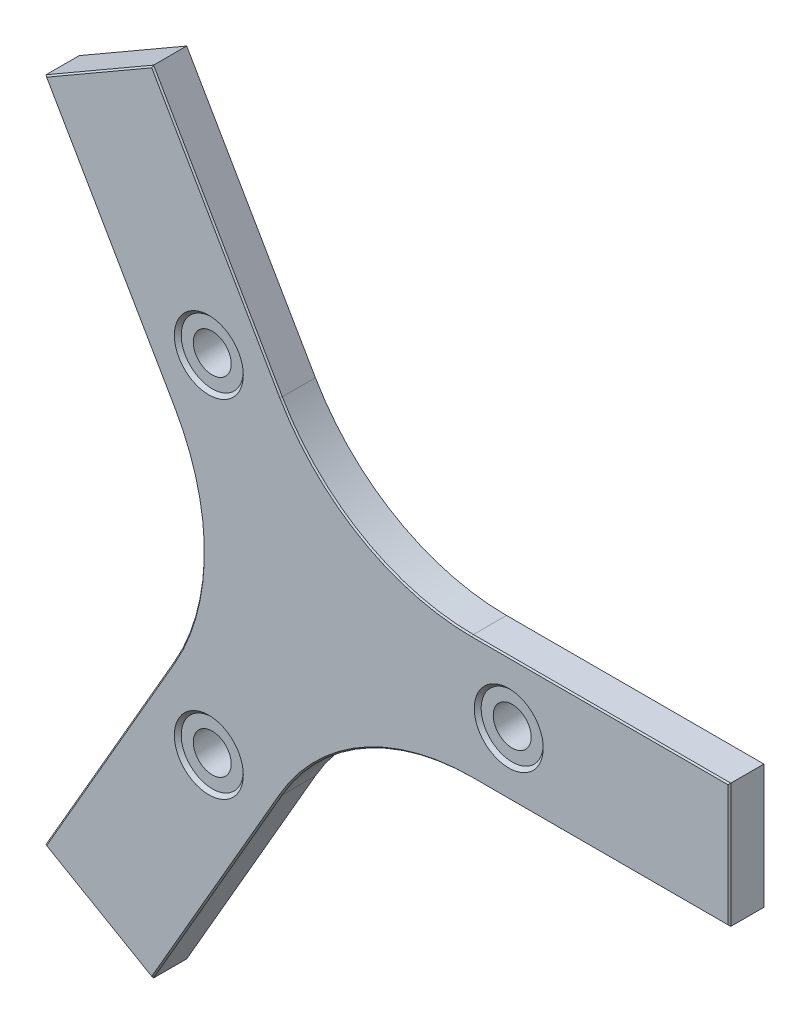
ISO-10303-21;
HEADER;
FILE_DESCRIPTION(('STEP AP214'),'2;1');
FILE_NAME('part.step','',(''),(''),'','','');
FILE_SCHEMA(('AUTOMOTIVE_DESIGN { 1 0 10303 214 1 1 1 1 }'));
ENDSEC;
DATA;
#1=APPLICATION_CONTEXT('core data for automotive mechanical design processes');
#2=APPLICATION_PROTOCOL_DEFINITION('international standard','automotive_design',2000,#1);
#3=PRODUCT_CONTEXT('',#1,'mechanical');
#4=PRODUCT('Part','Part','',(#3));
#5=PRODUCT_RELATED_PRODUCT_CATEGORY('part','',(#4));
#6=PRODUCT_DEFINITION_FORMATION('','',#4);
#7=PRODUCT_DEFINITION_CONTEXT('part definition',#1,'design');
#8=PRODUCT_DEFINITION('design','',#6,#7);
#9=PRODUCT_DEFINITION_SHAPE('','',#8);
#10=(LENGTH_UNIT() NAMED_UNIT(*) SI_UNIT(.MILLI.,.METRE.));
#11=(NAMED_UNIT(*) PLANE_ANGLE_UNIT() SI_UNIT($,.RADIAN.));
#12=(NAMED_UNIT(*) SI_UNIT($,.STERADIAN.) SOLID_ANGLE_UNIT());
#13=UNCERTAINTY_MEASURE_WITH_UNIT(LENGTH_MEASURE(1.E-05),#10,'distance_accuracy_value','');
#14=(GEOMETRIC_REPRESENTATION_CONTEXT(3) GLOBAL_UNCERTAINTY_ASSIGNED_CONTEXT((#13)) GLOBAL_UNIT_ASSIGNED_CONTEXT((#10,
#11,#12)) REPRESENTATION_CONTEXT('',''));
#15=CARTESIAN_POINT('',(0.,0.,0.));
#16=DIRECTION('',(0.,0.,1.));
#17=DIRECTION('',(1.,0.,0.));
#18=AXIS2_PLACEMENT_3D('',#15,#16,#17);
#19=CARTESIAN_POINT('',(29.,0.,78.9999999999509));
#20=DIRECTION('',(0.,0.,1.));
#21=DIRECTION('',(1.,0.,0.));
#22=AXIS2_PLACEMENT_3D('',#19,#20,#21);
#23=CONICAL_SURFACE('',#22,4.99999999993865,0.785398163397448);
#24=CARTESIAN_POINT('',(29.,0.,79.0000000000077));
#25=DIRECTION('',(0.,0.,1.));
#26=DIRECTION('',(1.,0.,0.));
#27=AXIS2_PLACEMENT_3D('',#24,#25,#26);
#28=CIRCLE('',#27,4.9999999999955);
#29=CARTESIAN_POINT('',(33.9999999999955,0.,79.0000000000077));
#30=VERTEX_POINT('',#29);
#31=EDGE_CURVE('E267',#30,#30,#28,.T.);
#32=ORIENTED_EDGE('',*,*,#31,.T.);
#33=EDGE_LOOP('',(#32));
#34=FACE_BOUND('',#33,.T.);
#35=CARTESIAN_POINT('',(29.,0.,78.5000000000196));
#36=DIRECTION('',(0.,0.,1.));
#37=DIRECTION('',(1.,0.,0.));
#38=AXIS2_PLACEMENT_3D('',#35,#36,#37);
#39=CIRCLE('',#38,4.50000000000732);
#40=CARTESIAN_POINT('',(33.5000000000073,0.,78.5000000000196));
#41=VERTEX_POINT('',#40);
#42=EDGE_CURVE('E264',#41,#41,#39,.T.);
#43=ORIENTED_EDGE('',*,*,#42,.F.);
#44=EDGE_LOOP('',(#43));
#45=FACE_BOUND('',#44,.T.);
#46=ADVANCED_FACE('F17',(#34,#45),#23,.F.);
#47=CARTESIAN_POINT('',(-14.5,-25.1147367097486,78.9999999999509));
#48=DIRECTION('',(0.,0.,1.));
#49=DIRECTION('',(1.,0.,0.));
#50=AXIS2_PLACEMENT_3D('',#47,#48,#49);
#51=CONICAL_SURFACE('',#50,4.99999999991465,0.785398163397448);
#52=CARTESIAN_POINT('',(-14.5,-25.1147367097486,79.0000000000077));
#53=DIRECTION('',(0.,0.,1.));
#54=DIRECTION('',(1.,0.,0.));
#55=AXIS2_PLACEMENT_3D('',#52,#53,#54);
#56=CIRCLE('',#55,4.99999999997149);
#57=CARTESIAN_POINT('',(-9.50000000002851,-25.1147367097486,79.0000000000077));
#58=VERTEX_POINT('',#57);
#59=EDGE_CURVE('E269',#58,#58,#56,.T.);
#60=ORIENTED_EDGE('',*,*,#59,.T.);
#61=EDGE_LOOP('',(#60));
#62=FACE_BOUND('',#61,.T.);
#63=CARTESIAN_POINT('',(-14.5,-25.1147367097486,78.5000000000196));
#64=DIRECTION('',(0.,0.,1.));
#65=DIRECTION('',(1.,0.,0.));
#66=AXIS2_PLACEMENT_3D('',#63,#64,#65);
#67=CIRCLE('',#66,4.49999999998331);
#68=CARTESIAN_POINT('',(-10.0000000000167,-25.1147367097486,78.5000000000196));
#69=VERTEX_POINT('',#68);
#70=EDGE_CURVE('E261',#69,#69,#67,.T.);
#71=ORIENTED_EDGE('',*,*,#70,.F.);
#72=EDGE_LOOP('',(#71));
#73=FACE_BOUND('',#72,.T.);
#74=ADVANCED_FACE('F291',(#62,#73),#51,.F.);
#75=CARTESIAN_POINT('',(-14.4999999999993,25.1147367097493,78.9999999999509));
#76=DIRECTION('',(0.,0.,1.));
#77=DIRECTION('',(1.,0.,0.));
#78=AXIS2_PLACEMENT_3D('',#75,#76,#77);
#79=CONICAL_SURFACE('',#78,4.99999999990643,0.785398163397448);
#80=CARTESIAN_POINT('',(-14.4999999999993,25.1147367097493,79.0000000000077));
#81=DIRECTION('',(0.,0.,1.));
#82=DIRECTION('',(1.,0.,0.));
#83=AXIS2_PLACEMENT_3D('',#80,#81,#82);
#84=CIRCLE('',#83,4.99999999996327);
#85=CARTESIAN_POINT('',(-9.50000000003603,25.1147367097493,79.0000000000077));
#86=VERTEX_POINT('',#85);
#87=EDGE_CURVE('E20',#86,#86,#84,.T.);
#88=ORIENTED_EDGE('',*,*,#87,.T.);
#89=EDGE_LOOP('',(#88));
#90=FACE_BOUND('',#89,.T.);
#91=CARTESIAN_POINT('',(-14.4999999999993,25.1147367097493,78.5000000000196));
#92=DIRECTION('',(0.,0.,1.));
#93=DIRECTION('',(1.,0.,0.));
#94=AXIS2_PLACEMENT_3D('',#91,#92,#93);
#95=CIRCLE('',#94,4.4999999999751);
#96=CARTESIAN_POINT('',(-10.0000000000242,25.1147367097493,78.5000000000196));
#97=VERTEX_POINT('',#96);
#98=EDGE_CURVE('E159',#97,#97,#95,.T.);
#99=ORIENTED_EDGE('',*,*,#98,.F.);
#100=EDGE_LOOP('',(#99));
#101=FACE_BOUND('',#100,.T.);
#102=ADVANCED_FACE('F276',(#90,#101),#79,.F.);
#103=CARTESIAN_POINT('',(3.41948691584548E-13,6.12843109593086E-13,79.));
#104=DIRECTION('',(0.,0.,-1.));
#105=DIRECTION('',(-1.,0.,0.));
#106=AXIS2_PLACEMENT_3D('',#103,#104,#105);
#107=PLANE('',#106);
#108=DIRECTION('',(0.866025403784439,0.5,0.));
#109=VECTOR('',#108,1.);
#110=CARTESIAN_POINT('',(-38.0210235533021,48.2543445500939,79.));
#111=LINE('',#110,#109);
#112=CARTESIAN_POINT('',(-38.0210235533022,48.2543445500939,79.));
#113=VERTEX_POINT('',#112);
#114=CARTESIAN_POINT('',(-22.7789764466961,57.0543445500938,79.));
#115=VERTEX_POINT('',#114);
#116=EDGE_CURVE('E211',#113,#115,#111,.T.);
#117=ORIENTED_EDGE('',*,*,#116,.F.);
#118=DIRECTION('',(-0.5,0.86602540378444,0.));
#119=VECTOR('',#118,1.);
#120=CARTESIAN_POINT('',(-19.4567040716902,16.100000000001,79.));
#121=LINE('',#120,#119);
#122=CARTESIAN_POINT('',(-19.4567040716902,16.1000000000007,79.));
#123=VERTEX_POINT('',#122);
#124=EDGE_CURVE('E149',#123,#113,#121,.T.);
#125=ORIENTED_EDGE('',*,*,#124,.F.);
#126=CARTESIAN_POINT('',(-47.3427220735486,7.28306304154103E-13,79.));
#127=DIRECTION('',(0.,0.,1.));
#128=DIRECTION('',(1.,0.,0.));
#129=AXIS2_PLACEMENT_3D('',#126,#127,#128);
#130=CIRCLE('',#129,32.2);
#131=CARTESIAN_POINT('',(-19.45670407169,-16.0999999999993,79.));
#132=VERTEX_POINT('',#131);
#133=EDGE_CURVE('E140',#123,#132,#130,.F.);
#134=ORIENTED_EDGE('',*,*,#133,.T.);
#135=DIRECTION('',(0.5,0.866025403784439,0.));
#136=VECTOR('',#135,1.);
#137=CARTESIAN_POINT('',(-38.0210235533022,-48.2543445500923,79.));
#138=LINE('',#137,#136);
#139=CARTESIAN_POINT('',(-38.0210235533022,-48.2543445500923,79.));
#140=VERTEX_POINT('',#139);
#141=EDGE_CURVE('E146',#140,#132,#138,.T.);
#142=ORIENTED_EDGE('',*,*,#141,.F.);
#143=DIRECTION('',(-0.866025403784438,0.5,0.));
#144=VECTOR('',#143,1.);
#145=CARTESIAN_POINT('',(-22.7789764466961,-57.0543445500924,79.));
#146=LINE('',#145,#144);
#147=CARTESIAN_POINT('',(-22.7789764466961,-57.0543445500924,79.));
#148=VERTEX_POINT('',#147);
#149=EDGE_CURVE('E177',#148,#140,#146,.T.);
#150=ORIENTED_EDGE('',*,*,#149,.F.);
#151=DIRECTION('',(-0.5,-0.866025403784439,0.));
#152=VECTOR('',#151,1.);
#153=CARTESIAN_POINT('',(-4.21465696508395,-24.8999999999994,79.));
#154=LINE('',#153,#152);
#155=CARTESIAN_POINT('',(-4.21465696508414,-24.8999999999996,79.));
#156=VERTEX_POINT('',#155);
#157=EDGE_CURVE('E174',#156,#148,#154,.T.);
#158=ORIENTED_EDGE('',*,*,#157,.F.);
#159=CARTESIAN_POINT('',(23.671361036775,-41.,79.));
#160=DIRECTION('',(0.,0.,1.));
#161=DIRECTION('',(1.,0.,0.));
#162=AXIS2_PLACEMENT_3D('',#159,#160,#161);
#163=CIRCLE('',#162,32.2);
#164=CARTESIAN_POINT('',(23.671361036775,-8.79999999999962,79.));
#165=VERTEX_POINT('',#164);
#166=EDGE_CURVE('E253',#156,#165,#163,.F.);
#167=ORIENTED_EDGE('',*,*,#166,.T.);
#168=DIRECTION('',(1.,0.,0.));
#169=VECTOR('',#168,1.);
#170=CARTESIAN_POINT('',(11.8356805183877,-8.79999999999941,79.));
#171=LINE('',#170,#169);
#172=CARTESIAN_POINT('',(60.8,-8.79999999999934,79.));
#173=VERTEX_POINT('',#172);
#174=EDGE_CURVE('E186',#173,#165,#171,.F.);
#175=ORIENTED_EDGE('',*,*,#174,.F.);
#176=DIRECTION('',(0.,1.,0.));
#177=VECTOR('',#176,1.);
#178=CARTESIAN_POINT('',(60.8,-4.49999999999939,79.));
#179=LINE('',#178,#177);
#180=CARTESIAN_POINT('',(60.8,8.80000000000057,79.));
#181=VERTEX_POINT('',#180);
#182=EDGE_CURVE('E193',#181,#173,#179,.F.);
#183=ORIENTED_EDGE('',*,*,#182,.F.);
#184=DIRECTION('',(1.,0.,0.));
#185=VECTOR('',#184,1.);
#186=CARTESIAN_POINT('',(30.5,8.80000000000058,79.));
#187=LINE('',#186,#185);
#188=CARTESIAN_POINT('',(23.671361036775,8.80000000000059,79.));
#189=VERTEX_POINT('',#188);
#190=EDGE_CURVE('E199',#189,#181,#187,.T.);
#191=ORIENTED_EDGE('',*,*,#190,.F.);
#192=CARTESIAN_POINT('',(23.671361036775,41.0000000000006,79.));
#193=DIRECTION('',(0.,0.,1.));
#194=DIRECTION('',(1.,0.,0.));
#195=AXIS2_PLACEMENT_3D('',#192,#193,#194);
#196=CIRCLE('',#195,32.2);
#197=CARTESIAN_POINT('',(-4.21465696508386,24.9000000000005,79.));
#198=VERTEX_POINT('',#197);
#199=EDGE_CURVE('E202',#189,#198,#196,.F.);
#200=ORIENTED_EDGE('',*,*,#199,.T.);
#201=DIRECTION('',(0.5,-0.86602540378444,0.));
#202=VECTOR('',#201,1.);
#203=CARTESIAN_POINT('',(-22.7789764466961,57.0543445500938,79.));
#204=LINE('',#203,#202);
#205=EDGE_CURVE('E205',#115,#198,#204,.T.);
#206=ORIENTED_EDGE('',*,*,#205,.F.);
#207=EDGE_LOOP('',(#117,#125,#134,#142,#150,#158,#167,#175,#183,#191,#200,#206));
#208=FACE_BOUND('',#207,.T.);
#209=ORIENTED_EDGE('',*,*,#31,.F.);
#210=EDGE_LOOP('',(#209));
#211=FACE_BOUND('',#210,.T.);
#212=ORIENTED_EDGE('',*,*,#59,.F.);
#213=EDGE_LOOP('',(#212));
#214=FACE_BOUND('',#213,.T.);
#215=ORIENTED_EDGE('',*,*,#87,.F.);
#216=EDGE_LOOP('',(#215));
#217=FACE_BOUND('',#216,.T.);
#218=ADVANCED_FACE('F144',(#208,#211,#214,#217),#107,.F.);
#219=CARTESIAN_POINT('',(29.,-5.,78.5));
#220=DIRECTION('',(0.,0.,1.));
#221=DIRECTION('',(1.,0.,0.));
#222=AXIS2_PLACEMENT_3D('',#219,#220,#221);
#223=PLANE('',#222);
#224=ORIENTED_EDGE('',*,*,#42,.T.);
#225=EDGE_LOOP('',(#224));
#226=FACE_BOUND('',#225,.T.);
#227=CARTESIAN_POINT('',(29.,0.,78.5));
#228=DIRECTION('',(0.,0.,-1.));
#229=DIRECTION('',(-1.,0.,0.));
#230=AXIS2_PLACEMENT_3D('',#227,#228,#229);
#231=CIRCLE('',#230,2.75);
#232=CARTESIAN_POINT('',(26.25,0.,78.5));
#233=VERTEX_POINT('',#232);
#234=EDGE_CURVE('E249',#233,#233,#231,.T.);
#235=ORIENTED_EDGE('',*,*,#234,.T.);
#236=EDGE_LOOP('',(#235));
#237=FACE_BOUND('',#236,.T.);
#238=ADVANCED_FACE('F280',(#226,#237),#223,.T.);
#239=CARTESIAN_POINT('',(-14.5,-30.1147367097486,78.5));
#240=DIRECTION('',(0.,0.,1.));
#241=DIRECTION('',(1.,0.,0.));
#242=AXIS2_PLACEMENT_3D('',#239,#240,#241);
#243=PLANE('',#242);
#244=ORIENTED_EDGE('',*,*,#70,.T.);
#245=EDGE_LOOP('',(#244));
#246=FACE_BOUND('',#245,.T.);
#247=CARTESIAN_POINT('',(-14.5,-25.1147367097486,78.5));
#248=DIRECTION('',(0.,0.,-1.));
#249=DIRECTION('',(-1.,0.,0.));
#250=AXIS2_PLACEMENT_3D('',#247,#248,#249);
#251=CIRCLE('',#250,2.75);
#252=CARTESIAN_POINT('',(-17.25,-25.1147367097486,78.5));
#253=VERTEX_POINT('',#252);
#254=EDGE_CURVE('E246',#253,#253,#251,.T.);
#255=ORIENTED_EDGE('',*,*,#254,.T.);
#256=EDGE_LOOP('',(#255));
#257=FACE_BOUND('',#256,.T.);
#258=ADVANCED_FACE('F288',(#246,#257),#243,.T.);
#259=CARTESIAN_POINT('',(-14.4999999999993,20.1147367097493,78.5));
#260=DIRECTION('',(0.,0.,1.));
#261=DIRECTION('',(1.,0.,0.));
#262=AXIS2_PLACEMENT_3D('',#259,#260,#261);
#263=PLANE('',#262);
#264=ORIENTED_EDGE('',*,*,#98,.T.);
#265=EDGE_LOOP('',(#264));
#266=FACE_BOUND('',#265,.T.);
#267=CARTESIAN_POINT('',(-14.4999999999993,25.1147367097493,78.5));
#268=DIRECTION('',(0.,0.,-1.));
#269=DIRECTION('',(-1.,0.,0.));
#270=AXIS2_PLACEMENT_3D('',#267,#268,#269);
#271=CIRCLE('',#270,2.75);
#272=CARTESIAN_POINT('',(-17.2499999999993,25.1147367097493,78.5));
#273=VERTEX_POINT('',#272);
#274=EDGE_CURVE('E242',#273,#273,#271,.T.);
#275=ORIENTED_EDGE('',*,*,#274,.T.);
#276=EDGE_LOOP('',(#275));
#277=FACE_BOUND('',#276,.T.);
#278=ADVANCED_FACE('F406',(#266,#277),#263,.T.);
#279=CARTESIAN_POINT('',(-13.6254663528748,-5.79999999999934,78.9));
#280=DIRECTION('',(-0.612372435695819,0.353553390593288,0.707106781186519));
#281=DIRECTION('',(0.755928946018428,0.,0.654653670708007));
#282=AXIS2_PLACEMENT_3D('',#279,#280,#281);
#283=PLANE('',#282);
#284=DIRECTION('',(-0.5,-0.866025403784439,0.));
#285=VECTOR('',#284,1.);
#286=CARTESIAN_POINT('',(-19.6299091524469,-15.9999999999993,78.8));
#287=LINE('',#286,#285);
#288=CARTESIAN_POINT('',(-38.2942286340591,-48.3275496308492,78.8));
#289=VERTEX_POINT('',#288);
#290=CARTESIAN_POINT('',(-19.6299091524467,-15.9999999999994,78.8));
#291=VERTEX_POINT('',#290);
#292=EDGE_CURVE('E245',#289,#291,#287,.F.);
#293=ORIENTED_EDGE('',*,*,#292,.F.);
#294=DIRECTION('',(-0.788675134594745,-0.211324865405342,-0.577350269189663));
#295=VECTOR('',#294,1.);
#296=CARTESIAN_POINT('',(-38.0210235533023,-48.2543445500923,79.));
#297=LINE('',#296,#295);
#298=EDGE_CURVE('E157',#140,#289,#297,.T.);
#299=ORIENTED_EDGE('',*,*,#298,.F.);
#300=ORIENTED_EDGE('',*,*,#141,.T.);
#301=DIRECTION('',(-0.61237243569578,0.353553390593272,-0.707106781186561));
#302=VECTOR('',#301,1.);
#303=CARTESIAN_POINT('',(-19.5433066120682,-16.0499999999995,78.9));
#304=LINE('',#303,#302);
#305=EDGE_CURVE('E151',#132,#291,#304,.T.);
#306=ORIENTED_EDGE('',*,*,#305,.T.);
#307=EDGE_LOOP('',(#293,#299,#300,#306));
#308=FACE_BOUND('',#307,.T.);
#309=ADVANCED_FACE('F154',(#308),#283,.T.);
#310=CARTESIAN_POINT('',(-47.3427220735486,7.28306304154103E-13,79.));
#311=DIRECTION('',(0.,0.,1.));
#312=DIRECTION('',(1.,0.,0.));
#313=AXIS2_PLACEMENT_3D('',#310,#311,#312);
#314=CONICAL_SURFACE('',#313,32.2,0.785398163397431);
#315=ORIENTED_EDGE('',*,*,#305,.F.);
#316=ORIENTED_EDGE('',*,*,#133,.F.);
#317=DIRECTION('',(0.61237243569569,0.353553390593389,0.707106781186581));
#318=VECTOR('',#317,1.);
#319=CARTESIAN_POINT('',(-19.629909152447,16.000000000001,78.8));
#320=LINE('',#319,#318);
#321=CARTESIAN_POINT('',(-19.6299091524469,16.000000000001,78.8));
#322=VERTEX_POINT('',#321);
#323=EDGE_CURVE('E166',#322,#123,#320,.T.);
#324=ORIENTED_EDGE('',*,*,#323,.F.);
#325=CARTESIAN_POINT('',(-47.3427220735486,7.28306304154103E-13,78.8));
#326=DIRECTION('',(0.,0.,1.));
#327=DIRECTION('',(1.,0.,0.));
#328=AXIS2_PLACEMENT_3D('',#325,#326,#327);
#329=CIRCLE('',#328,32.);
#330=EDGE_CURVE('E164',#322,#291,#329,.F.);
#331=ORIENTED_EDGE('',*,*,#330,.T.);
#332=EDGE_LOOP('',(#315,#316,#324,#331));
#333=FACE_BOUND('',#332,.T.);
#334=ADVANCED_FACE('F162',(#333),#314,.F.);
#335=CARTESIAN_POINT('',(-22.9576260936809,21.9637748154256,78.9));
#336=DIRECTION('',(-0.61237243569582,-0.353553390593287,0.707106781186519));
#337=DIRECTION('',(0.755928946018428,0.,0.654653670708008));
#338=AXIS2_PLACEMENT_3D('',#335,#336,#337);
#339=PLANE('',#338);
#340=ORIENTED_EDGE('',*,*,#124,.T.);
#341=DIRECTION('',(0.788675134594903,-0.211324865405145,0.577350269189518));
#342=VECTOR('',#341,1.);
#343=CARTESIAN_POINT('',(-38.2942286340591,48.3275496308508,78.8));
#344=LINE('',#343,#342);
#345=CARTESIAN_POINT('',(-38.2942286340591,48.3275496308508,78.8));
#346=VERTEX_POINT('',#345);
#347=EDGE_CURVE('E208',#346,#113,#344,.T.);
#348=ORIENTED_EDGE('',*,*,#347,.F.);
#349=DIRECTION('',(0.5,-0.866025403784439,0.));
#350=VECTOR('',#349,1.);
#351=CARTESIAN_POINT('',(-38.2942286340591,48.3275496308508,78.8));
#352=LINE('',#351,#350);
#353=EDGE_CURVE('E662',#322,#346,#352,.F.);
#354=ORIENTED_EDGE('',*,*,#353,.F.);
#355=ORIENTED_EDGE('',*,*,#323,.T.);
#356=EDGE_LOOP('',(#340,#348,#354,#355));
#357=FACE_BOUND('',#356,.T.);
#358=ADVANCED_FACE('F397',(#357),#339,.T.);
#359=CARTESIAN_POINT('',(-26.5528856829693,54.9909470904723,78.9));
#360=DIRECTION('',(-0.353553390593233,0.612372435695721,0.707106781186632));
#361=DIRECTION('',(0.,-0.755928946018532,0.654653670707888));
#362=AXIS2_PLACEMENT_3D('',#359,#360,#361);
#363=PLANE('',#362);
#364=DIRECTION('',(-0.866025403784439,-0.5,0.));
#365=VECTOR('',#364,1.);
#366=CARTESIAN_POINT('',(-22.7057713659392,57.3275496308508,78.8));
#367=LINE('',#366,#365);
#368=CARTESIAN_POINT('',(-22.7057713659393,57.3275496308508,78.8));
#369=VERTEX_POINT('',#368);
#370=EDGE_CURVE('E652',#346,#369,#367,.F.);
#371=ORIENTED_EDGE('',*,*,#370,.F.);
#372=ORIENTED_EDGE('',*,*,#347,.T.);
#373=ORIENTED_EDGE('',*,*,#116,.T.);
#374=DIRECTION('',(-0.211324865405075,-0.788675134594863,0.577350269189598));
#375=VECTOR('',#374,1.);
#376=CARTESIAN_POINT('',(-22.7057713659392,57.3275496308508,78.8));
#377=LINE('',#376,#375);
#378=EDGE_CURVE('E207',#369,#115,#377,.T.);
#379=ORIENTED_EDGE('',*,*,#378,.F.);
#380=EDGE_LOOP('',(#371,#372,#373,#379));
#381=FACE_BOUND('',#380,.T.);
#382=ADVANCED_FACE('F393',(#381),#363,.T.);
#383=CARTESIAN_POINT('',(1.78978583448839,14.7000000000004,78.9));
#384=DIRECTION('',(0.612372435695819,0.353553390593288,0.707106781186519));
#385=DIRECTION('',(0.755928946018428,0.,-0.654653670708007));
#386=AXIS2_PLACEMENT_3D('',#383,#384,#385);
#387=PLANE('',#386);
#388=DIRECTION('',(-0.5,0.866025403784439,0.));
#389=VECTOR('',#388,1.);
#390=CARTESIAN_POINT('',(-4.04145188432687,25.0000000000004,78.8));
#391=LINE('',#390,#389);
#392=CARTESIAN_POINT('',(-4.04145188432689,25.0000000000004,78.8));
#393=VERTEX_POINT('',#392);
#394=EDGE_CURVE('E751',#369,#393,#391,.F.);
#395=ORIENTED_EDGE('',*,*,#394,.F.);
#396=ORIENTED_EDGE('',*,*,#378,.T.);
#397=ORIENTED_EDGE('',*,*,#205,.T.);
#398=DIRECTION('',(0.612372435695827,0.353553390593301,-0.707106781186506));
#399=VECTOR('',#398,1.);
#400=CARTESIAN_POINT('',(-4.12805442470532,24.9500000000004,78.9));
#401=LINE('',#400,#399);
#402=EDGE_CURVE('E257',#198,#393,#401,.T.);
#403=ORIENTED_EDGE('',*,*,#402,.T.);
#404=EDGE_LOOP('',(#395,#396,#397,#403));
#405=FACE_BOUND('',#404,.T.);
#406=ADVANCED_FACE('F389',(#405),#387,.T.);
#407=CARTESIAN_POINT('',(23.671361036775,41.0000000000006,79.));
#408=DIRECTION('',(0.,0.,1.));
#409=DIRECTION('',(1.,0.,0.));
#410=AXIS2_PLACEMENT_3D('',#407,#408,#409);
#411=CONICAL_SURFACE('',#410,32.2,0.785398163397518);
#412=DIRECTION('',(0.,-0.707106781186528,0.707106781186568));
#413=VECTOR('',#412,1.);
#414=CARTESIAN_POINT('',(23.671361036775,8.90000000000059,78.9));
#415=LINE('',#414,#413);
#416=CARTESIAN_POINT('',(23.671361036775,9.00000000000061,78.8));
#417=VERTEX_POINT('',#416);
#418=EDGE_CURVE('E196',#417,#189,#415,.T.);
#419=ORIENTED_EDGE('',*,*,#418,.F.);
#420=CARTESIAN_POINT('',(23.671361036775,41.0000000000006,78.8));
#421=DIRECTION('',(0.,0.,1.));
#422=DIRECTION('',(1.,0.,0.));
#423=AXIS2_PLACEMENT_3D('',#420,#421,#422);
#424=CIRCLE('',#423,32.);
#425=EDGE_CURVE('E732',#417,#393,#424,.F.);
#426=ORIENTED_EDGE('',*,*,#425,.T.);
#427=ORIENTED_EDGE('',*,*,#402,.F.);
#428=ORIENTED_EDGE('',*,*,#199,.F.);
#429=EDGE_LOOP('',(#419,#426,#427,#428));
#430=FACE_BOUND('',#429,.T.);
#431=ADVANCED_FACE('F385',(#430),#411,.F.);
#432=CARTESIAN_POINT('',(30.5,8.90000000000059,78.9));
#433=DIRECTION('',(0.,0.707106781186568,0.707106781186528));
#434=DIRECTION('',(0.,-0.707106781186528,0.707106781186568));
#435=AXIS2_PLACEMENT_3D('',#432,#433,#434);
#436=PLANE('',#435);
#437=DIRECTION('',(-1.,0.,0.));
#438=VECTOR('',#437,1.);
#439=CARTESIAN_POINT('',(61.,9.00000000000062,78.8));
#440=LINE('',#439,#438);
#441=CARTESIAN_POINT('',(61.,9.00000000000062,78.8));
#442=VERTEX_POINT('',#441);
#443=EDGE_CURVE('E729',#417,#442,#440,.F.);
#444=ORIENTED_EDGE('',*,*,#443,.F.);
#445=ORIENTED_EDGE('',*,*,#418,.T.);
#446=ORIENTED_EDGE('',*,*,#190,.T.);
#447=DIRECTION('',(-0.577350269189556,-0.577350269189726,0.577350269189596));
#448=VECTOR('',#447,1.);
#449=CARTESIAN_POINT('',(61.,9.00000000000062,78.8));
#450=LINE('',#449,#448);
#451=EDGE_CURVE('E190',#442,#181,#450,.T.);
#452=ORIENTED_EDGE('',*,*,#451,.F.);
#453=EDGE_LOOP('',(#444,#445,#446,#452));
#454=FACE_BOUND('',#453,.T.);
#455=ADVANCED_FACE('F381',(#454),#436,.T.);
#456=CARTESIAN_POINT('',(60.9,-4.49999999999939,78.9));
#457=DIRECTION('',(0.707106781186568,0.,0.707106781186528));
#458=DIRECTION('',(0.707106781186528,0.,-0.707106781186568));
#459=AXIS2_PLACEMENT_3D('',#456,#457,#458);
#460=PLANE('',#459);
#461=DIRECTION('',(0.,1.,0.));
#462=VECTOR('',#461,1.);
#463=CARTESIAN_POINT('',(61.,-8.99999999999938,78.8));
#464=LINE('',#463,#462);
#465=CARTESIAN_POINT('',(61.,-8.9999999999994,78.8));
#466=VERTEX_POINT('',#465);
#467=EDGE_CURVE('E719',#442,#466,#464,.F.);
#468=ORIENTED_EDGE('',*,*,#467,.F.);
#469=ORIENTED_EDGE('',*,*,#451,.T.);
#470=ORIENTED_EDGE('',*,*,#182,.T.);
#471=DIRECTION('',(-0.577350269189574,0.577350269189629,0.577350269189674));
#472=VECTOR('',#471,1.);
#473=CARTESIAN_POINT('',(61.,-8.99999999999935,78.8));
#474=LINE('',#473,#472);
#475=EDGE_CURVE('E189',#466,#173,#474,.T.);
#476=ORIENTED_EDGE('',*,*,#475,.F.);
#477=EDGE_LOOP('',(#468,#469,#470,#476));
#478=FACE_BOUND('',#477,.T.);
#479=ADVANCED_FACE('F377',(#478),#460,.T.);
#480=CARTESIAN_POINT('',(11.8356805183877,-8.89999999999947,78.9));
#481=DIRECTION('',(0.,-0.707106781186568,0.707106781186528));
#482=DIRECTION('',(0.,-0.707106781186528,-0.707106781186568));
#483=AXIS2_PLACEMENT_3D('',#480,#481,#482);
#484=PLANE('',#483);
#485=DIRECTION('',(1.,0.,0.));
#486=VECTOR('',#485,1.);
#487=CARTESIAN_POINT('',(23.671361036775,-8.9999999999995,78.8));
#488=LINE('',#487,#486);
#489=CARTESIAN_POINT('',(23.671361036775,-8.99999999999988,78.8));
#490=VERTEX_POINT('',#489);
#491=EDGE_CURVE('E712',#466,#490,#488,.F.);
#492=ORIENTED_EDGE('',*,*,#491,.F.);
#493=ORIENTED_EDGE('',*,*,#475,.T.);
#494=ORIENTED_EDGE('',*,*,#174,.T.);
#495=DIRECTION('',(0.,-0.707106781186603,-0.707106781186492));
#496=VECTOR('',#495,1.);
#497=CARTESIAN_POINT('',(23.671361036775,-8.9,78.9));
#498=LINE('',#497,#496);
#499=EDGE_CURVE('E255',#165,#490,#498,.T.);
#500=ORIENTED_EDGE('',*,*,#499,.T.);
#501=EDGE_LOOP('',(#492,#493,#494,#500));
#502=FACE_BOUND('',#501,.T.);
#503=ADVANCED_FACE('F373',(#502),#484,.T.);
#504=CARTESIAN_POINT('',(23.671361036775,-41.,79.));
#505=DIRECTION('',(0.,0.,1.));
#506=DIRECTION('',(1.,0.,0.));
#507=AXIS2_PLACEMENT_3D('',#504,#505,#506);
#508=CONICAL_SURFACE('',#507,32.2,0.785398163397535);
#509=ORIENTED_EDGE('',*,*,#499,.F.);
#510=ORIENTED_EDGE('',*,*,#166,.F.);
#511=DIRECTION('',(-0.612372435695803,0.353553390593193,0.707106781186581));
#512=VECTOR('',#511,1.);
#513=CARTESIAN_POINT('',(-4.04145188432704,-24.9999999999994,78.8));
#514=LINE('',#513,#512);
#515=CARTESIAN_POINT('',(-4.04145188432697,-24.9999999999994,78.8));
#516=VERTEX_POINT('',#515);
#517=EDGE_CURVE('E178',#516,#156,#514,.T.);
#518=ORIENTED_EDGE('',*,*,#517,.F.);
#519=CARTESIAN_POINT('',(23.671361036775,-41.,78.8));
#520=DIRECTION('',(0.,0.,1.));
#521=DIRECTION('',(1.,0.,0.));
#522=AXIS2_PLACEMENT_3D('',#519,#520,#521);
#523=CIRCLE('',#522,32.);
#524=EDGE_CURVE('E684',#516,#490,#523,.F.);
#525=ORIENTED_EDGE('',*,*,#524,.T.);
#526=EDGE_LOOP('',(#509,#510,#518,#525));
#527=FACE_BOUND('',#526,.T.);
#528=ADVANCED_FACE('F369',(#527),#508,.F.);
#529=CARTESIAN_POINT('',(-7.54237390631795,-30.8637748154243,78.9));
#530=DIRECTION('',(0.612372435695819,-0.353553390593288,0.707106781186519));
#531=DIRECTION('',(0.755928946018428,0.,-0.654653670708007));
#532=AXIS2_PLACEMENT_3D('',#529,#530,#531);
#533=PLANE('',#532);
#534=ORIENTED_EDGE('',*,*,#157,.T.);
#535=DIRECTION('',(-0.211324865405182,0.788675134594845,0.577350269189583));
#536=VECTOR('',#535,1.);
#537=CARTESIAN_POINT('',(-22.7057713659392,-57.3275496308492,78.8));
#538=LINE('',#537,#536);
#539=CARTESIAN_POINT('',(-22.7057713659392,-57.3275496308492,78.8));
#540=VERTEX_POINT('',#539);
#541=EDGE_CURVE('E252',#540,#148,#538,.T.);
#542=ORIENTED_EDGE('',*,*,#541,.F.);
#543=DIRECTION('',(0.5,0.866025403784439,0.));
#544=VECTOR('',#543,1.);
#545=CARTESIAN_POINT('',(-22.7057713659392,-57.3275496308492,78.8));
#546=LINE('',#545,#544);
#547=EDGE_CURVE('E681',#516,#540,#546,.F.);
#548=ORIENTED_EDGE('',*,*,#547,.F.);
#549=ORIENTED_EDGE('',*,*,#517,.T.);
#550=EDGE_LOOP('',(#534,#542,#548,#549));
#551=FACE_BOUND('',#550,.T.);
#552=ADVANCED_FACE('F365',(#551),#533,.T.);
#553=CARTESIAN_POINT('',(-34.3471143170292,-50.4909470904707,78.9));
#554=DIRECTION('',(-0.353553390593254,-0.612372435695759,0.707106781186588));
#555=DIRECTION('',(0.,-0.755928946018492,-0.654653670707934));
#556=AXIS2_PLACEMENT_3D('',#553,#554,#555);
#557=PLANE('',#556);
#558=DIRECTION('',(0.866025403784439,-0.5,0.));
#559=VECTOR('',#558,1.);
#560=CARTESIAN_POINT('',(-38.2942286340591,-48.3275496308492,78.8));
#561=LINE('',#560,#559);
#562=EDGE_CURVE('E678',#540,#289,#561,.F.);
#563=ORIENTED_EDGE('',*,*,#562,.F.);
#564=ORIENTED_EDGE('',*,*,#541,.T.);
#565=ORIENTED_EDGE('',*,*,#149,.T.);
#566=ORIENTED_EDGE('',*,*,#298,.T.);
#567=EDGE_LOOP('',(#563,#564,#565,#566));
#568=FACE_BOUND('',#567,.T.);
#569=ADVANCED_FACE('F361',(#568),#557,.T.);
#570=CARTESIAN_POINT('',(29.,0.,79.));
#571=DIRECTION('',(0.,0.,-1.));
#572=DIRECTION('',(-1.,0.,0.));
#573=AXIS2_PLACEMENT_3D('',#570,#571,#572);
#574=CYLINDRICAL_SURFACE('',#573,2.75);
#575=ORIENTED_EDGE('',*,*,#234,.F.);
#576=EDGE_LOOP('',(#575));
#577=FACE_BOUND('',#576,.T.);
#578=CARTESIAN_POINT('',(29.,0.,74.));
#579=DIRECTION('',(0.,0.,-1.));
#580=DIRECTION('',(-1.,0.,0.));
#581=AXIS2_PLACEMENT_3D('',#578,#579,#580);
#582=CIRCLE('',#581,2.75);
#583=CARTESIAN_POINT('',(26.25,0.,74.));
#584=VERTEX_POINT('',#583);
#585=EDGE_CURVE('E239',#584,#584,#582,.F.);
#586=ORIENTED_EDGE('',*,*,#585,.F.);
#587=EDGE_LOOP('',(#586));
#588=FACE_BOUND('',#587,.T.);
#589=ADVANCED_FACE('F357',(#577,#588),#574,.F.);
#590=CARTESIAN_POINT('',(-14.5,-25.1147367097486,79.));
#591=DIRECTION('',(0.,0.,-1.));
#592=DIRECTION('',(-1.,0.,0.));
#593=AXIS2_PLACEMENT_3D('',#590,#591,#592);
#594=CYLINDRICAL_SURFACE('',#593,2.75);
#595=ORIENTED_EDGE('',*,*,#254,.F.);
#596=EDGE_LOOP('',(#595));
#597=FACE_BOUND('',#596,.T.);
#598=CARTESIAN_POINT('',(-14.5,-25.1147367097486,74.));
#599=DIRECTION('',(0.,0.,-1.));
#600=DIRECTION('',(-1.,0.,0.));
#601=AXIS2_PLACEMENT_3D('',#598,#599,#600);
#602=CIRCLE('',#601,2.75);
#603=CARTESIAN_POINT('',(-17.25,-25.1147367097486,74.));
#604=VERTEX_POINT('',#603);
#605=EDGE_CURVE('E236',#604,#604,#602,.F.);
#606=ORIENTED_EDGE('',*,*,#605,.F.);
#607=EDGE_LOOP('',(#606));
#608=FACE_BOUND('',#607,.T.);
#609=ADVANCED_FACE('F353',(#597,#608),#594,.F.);
#610=CARTESIAN_POINT('',(-14.4999999999993,25.1147367097493,79.));
#611=DIRECTION('',(0.,0.,-1.));
#612=DIRECTION('',(-1.,0.,0.));
#613=AXIS2_PLACEMENT_3D('',#610,#611,#612);
#614=CYLINDRICAL_SURFACE('',#613,2.75);
#615=ORIENTED_EDGE('',*,*,#274,.F.);
#616=EDGE_LOOP('',(#615));
#617=FACE_BOUND('',#616,.T.);
#618=CARTESIAN_POINT('',(-14.4999999999993,25.1147367097493,74.));
#619=DIRECTION('',(0.,0.,-1.));
#620=DIRECTION('',(-1.,0.,0.));
#621=AXIS2_PLACEMENT_3D('',#618,#619,#620);
#622=CIRCLE('',#621,2.75);
#623=CARTESIAN_POINT('',(-17.2499999999993,25.1147367097493,74.));
#624=VERTEX_POINT('',#623);
#625=EDGE_CURVE('E233',#624,#624,#622,.F.);
#626=ORIENTED_EDGE('',*,*,#625,.F.);
#627=EDGE_LOOP('',(#626));
#628=FACE_BOUND('',#627,.T.);
#629=ADVANCED_FACE('F349',(#617,#628),#614,.F.);
#630=CARTESIAN_POINT('',(-19.6299091524469,-15.9999999999993,79.));
#631=DIRECTION('',(-0.866025403784439,0.5,0.));
#632=DIRECTION('',(-0.5,-0.866025403784439,0.));
#633=AXIS2_PLACEMENT_3D('',#630,#631,#632);
#634=PLANE('',#633);
#635=DIRECTION('',(0.5,0.866025403784438,0.));
#636=VECTOR('',#635,1.);
#637=CARTESIAN_POINT('',(-38.2942286340591,-48.3275496308492,74.));
#638=LINE('',#637,#636);
#639=CARTESIAN_POINT('',(-38.2942286340591,-48.3275496308492,74.));
#640=VERTEX_POINT('',#639);
#641=CARTESIAN_POINT('',(-19.6299091524467,-15.9999999999993,74.));
#642=VERTEX_POINT('',#641);
#643=EDGE_CURVE('E232',#640,#642,#638,.T.);
#644=ORIENTED_EDGE('',*,*,#643,.F.);
#645=DIRECTION('',(0.,0.,1.));
#646=VECTOR('',#645,1.);
#647=CARTESIAN_POINT('',(-38.2942286340591,-48.3275496308492,79.));
#648=LINE('',#647,#646);
#649=EDGE_CURVE('E675',#289,#640,#648,.F.);
#650=ORIENTED_EDGE('',*,*,#649,.F.);
#651=ORIENTED_EDGE('',*,*,#292,.T.);
#652=DIRECTION('',(0.,0.,1.));
#653=VECTOR('',#652,1.);
#654=CARTESIAN_POINT('',(-19.6299091524467,-15.9999999999994,79.));
#655=LINE('',#654,#653);
#656=EDGE_CURVE('E663',#291,#642,#655,.F.);
#657=ORIENTED_EDGE('',*,*,#656,.T.);
#658=EDGE_LOOP('',(#644,#650,#651,#657));
#659=FACE_BOUND('',#658,.T.);
#660=ADVANCED_FACE('F345',(#659),#634,.T.);
#661=CARTESIAN_POINT('',(-47.3427220735486,7.28306304154103E-13,79.));
#662=DIRECTION('',(0.,0.,1.));
#663=DIRECTION('',(1.,0.,0.));
#664=AXIS2_PLACEMENT_3D('',#661,#662,#663);
#665=CYLINDRICAL_SURFACE('',#664,32.);
#666=DIRECTION('',(0.,0.,1.));
#667=VECTOR('',#666,1.);
#668=CARTESIAN_POINT('',(-19.629909152447,16.000000000001,79.));
#669=LINE('',#668,#667);
#670=CARTESIAN_POINT('',(-19.6299091524469,16.0000000000008,74.));
#671=VERTEX_POINT('',#670);
#672=EDGE_CURVE('E665',#671,#322,#669,.T.);
#673=ORIENTED_EDGE('',*,*,#672,.F.);
#674=CARTESIAN_POINT('',(-47.3427220735486,7.28306304154103E-13,74.));
#675=DIRECTION('',(0.,0.,1.));
#676=DIRECTION('',(1.,0.,0.));
#677=AXIS2_PLACEMENT_3D('',#674,#675,#676);
#678=CIRCLE('',#677,32.);
#679=EDGE_CURVE('E228',#642,#671,#678,.T.);
#680=ORIENTED_EDGE('',*,*,#679,.F.);
#681=ORIENTED_EDGE('',*,*,#656,.F.);
#682=ORIENTED_EDGE('',*,*,#330,.F.);
#683=EDGE_LOOP('',(#673,#680,#681,#682));
#684=FACE_BOUND('',#683,.T.);
#685=ADVANCED_FACE('F341',(#684),#665,.F.);
#686=CARTESIAN_POINT('',(-38.2942286340591,48.3275496308508,79.));
#687=DIRECTION('',(-0.866025403784439,-0.5,0.));
#688=DIRECTION('',(0.5,-0.866025403784439,0.));
#689=AXIS2_PLACEMENT_3D('',#686,#687,#688);
#690=PLANE('',#689);
#691=DIRECTION('',(-0.5,0.866025403784439,0.));
#692=VECTOR('',#691,1.);
#693=CARTESIAN_POINT('',(-19.629909152447,16.000000000001,74.));
#694=LINE('',#693,#692);
#695=CARTESIAN_POINT('',(-38.2942286340591,48.3275496308508,74.));
#696=VERTEX_POINT('',#695);
#697=EDGE_CURVE('E231',#671,#696,#694,.T.);
#698=ORIENTED_EDGE('',*,*,#697,.F.);
#699=ORIENTED_EDGE('',*,*,#672,.T.);
#700=ORIENTED_EDGE('',*,*,#353,.T.);
#701=DIRECTION('',(0.,0.,1.));
#702=VECTOR('',#701,1.);
#703=CARTESIAN_POINT('',(-38.2942286340591,48.3275496308508,79.));
#704=LINE('',#703,#702);
#705=EDGE_CURVE('E755',#696,#346,#704,.T.);
#706=ORIENTED_EDGE('',*,*,#705,.F.);
#707=EDGE_LOOP('',(#698,#699,#700,#706));
#708=FACE_BOUND('',#707,.T.);
#709=ADVANCED_FACE('F337',(#708),#690,.T.);
#710=CARTESIAN_POINT('',(-22.7057713659392,57.3275496308508,79.));
#711=DIRECTION('',(-0.5,0.866025403784439,0.));
#712=DIRECTION('',(-0.866025403784439,-0.5,0.));
#713=AXIS2_PLACEMENT_3D('',#710,#711,#712);
#714=PLANE('',#713);
#715=DIRECTION('',(0.866025403784439,0.5,0.));
#716=VECTOR('',#715,1.);
#717=CARTESIAN_POINT('',(-38.2942286340591,48.3275496308508,74.));
#718=LINE('',#717,#716);
#719=CARTESIAN_POINT('',(-22.7057713659392,57.3275496308508,74.));
#720=VERTEX_POINT('',#719);
#721=EDGE_CURVE('E778',#696,#720,#718,.T.);
#722=ORIENTED_EDGE('',*,*,#721,.F.);
#723=ORIENTED_EDGE('',*,*,#705,.T.);
#724=ORIENTED_EDGE('',*,*,#370,.T.);
#725=DIRECTION('',(0.,0.,1.));
#726=VECTOR('',#725,1.);
#727=CARTESIAN_POINT('',(-22.7057713659393,57.3275496308508,79.));
#728=LINE('',#727,#726);
#729=EDGE_CURVE('E754',#720,#369,#728,.T.);
#730=ORIENTED_EDGE('',*,*,#729,.F.);
#731=EDGE_LOOP('',(#722,#723,#724,#730));
#732=FACE_BOUND('',#731,.T.);
#733=ADVANCED_FACE('F333',(#732),#714,.T.);
#734=CARTESIAN_POINT('',(-4.04145188432687,25.0000000000004,79.));
#735=DIRECTION('',(0.866025403784439,0.5,0.));
#736=DIRECTION('',(-0.5,0.866025403784439,0.));
#737=AXIS2_PLACEMENT_3D('',#734,#735,#736);
#738=PLANE('',#737);
#739=DIRECTION('',(0.5,-0.86602540378444,0.));
#740=VECTOR('',#739,1.);
#741=CARTESIAN_POINT('',(-22.7057713659392,57.3275496308508,74.));
#742=LINE('',#741,#740);
#743=CARTESIAN_POINT('',(-4.04145188432697,25.0000000000006,74.));
#744=VERTEX_POINT('',#743);
#745=EDGE_CURVE('E227',#720,#744,#742,.T.);
#746=ORIENTED_EDGE('',*,*,#745,.F.);
#747=ORIENTED_EDGE('',*,*,#729,.T.);
#748=ORIENTED_EDGE('',*,*,#394,.T.);
#749=DIRECTION('',(0.,0.,1.));
#750=VECTOR('',#749,1.);
#751=CARTESIAN_POINT('',(-4.04145188432691,25.0000000000004,79.));
#752=LINE('',#751,#750);
#753=EDGE_CURVE('E741',#393,#744,#752,.F.);
#754=ORIENTED_EDGE('',*,*,#753,.T.);
#755=EDGE_LOOP('',(#746,#747,#748,#754));
#756=FACE_BOUND('',#755,.T.);
#757=ADVANCED_FACE('F329',(#756),#738,.T.);
#758=CARTESIAN_POINT('',(23.671361036775,41.0000000000006,79.));
#759=DIRECTION('',(0.,0.,1.));
#760=DIRECTION('',(1.,0.,0.));
#761=AXIS2_PLACEMENT_3D('',#758,#759,#760);
#762=CYLINDRICAL_SURFACE('',#761,32.);
#763=DIRECTION('',(0.,0.,1.));
#764=VECTOR('',#763,1.);
#765=CARTESIAN_POINT('',(23.671361036775,9.00000000000063,79.));
#766=LINE('',#765,#764);
#767=CARTESIAN_POINT('',(23.671361036775,9.00000000000062,74.));
#768=VERTEX_POINT('',#767);
#769=EDGE_CURVE('E722',#768,#417,#766,.T.);
#770=ORIENTED_EDGE('',*,*,#769,.F.);
#771=CARTESIAN_POINT('',(23.671361036775,41.0000000000006,74.));
#772=DIRECTION('',(0.,0.,1.));
#773=DIRECTION('',(1.,0.,0.));
#774=AXIS2_PLACEMENT_3D('',#771,#772,#773);
#775=CIRCLE('',#774,32.);
#776=EDGE_CURVE('E223',#744,#768,#775,.T.);
#777=ORIENTED_EDGE('',*,*,#776,.F.);
#778=ORIENTED_EDGE('',*,*,#753,.F.);
#779=ORIENTED_EDGE('',*,*,#425,.F.);
#780=EDGE_LOOP('',(#770,#777,#778,#779));
#781=FACE_BOUND('',#780,.T.);
#782=ADVANCED_FACE('F325',(#781),#762,.F.);
#783=CARTESIAN_POINT('',(61.,9.00000000000062,79.));
#784=DIRECTION('',(0.,1.,0.));
#785=DIRECTION('',(-1.,0.,0.));
#786=AXIS2_PLACEMENT_3D('',#783,#784,#785);
#787=PLANE('',#786);
#788=DIRECTION('',(-1.,0.,0.));
#789=VECTOR('',#788,1.);
#790=CARTESIAN_POINT('',(-19.6299091524469,9.00000000000062,74.));
#791=LINE('',#790,#789);
#792=CARTESIAN_POINT('',(61.,9.00000000000062,74.));
#793=VERTEX_POINT('',#792);
#794=EDGE_CURVE('E226',#768,#793,#791,.F.);
#795=ORIENTED_EDGE('',*,*,#794,.F.);
#796=ORIENTED_EDGE('',*,*,#769,.T.);
#797=ORIENTED_EDGE('',*,*,#443,.T.);
#798=DIRECTION('',(0.,0.,1.));
#799=VECTOR('',#798,1.);
#800=CARTESIAN_POINT('',(61.,9.00000000000062,79.));
#801=LINE('',#800,#799);
#802=EDGE_CURVE('E716',#793,#442,#801,.T.);
#803=ORIENTED_EDGE('',*,*,#802,.F.);
#804=EDGE_LOOP('',(#795,#796,#797,#803));
#805=FACE_BOUND('',#804,.T.);
#806=ADVANCED_FACE('F321',(#805),#787,.T.);
#807=CARTESIAN_POINT('',(61.,-8.99999999999938,79.));
#808=DIRECTION('',(1.,0.,0.));
#809=DIRECTION('',(0.,1.,0.));
#810=AXIS2_PLACEMENT_3D('',#807,#808,#809);
#811=PLANE('',#810);
#812=DIRECTION('',(0.,1.,0.));
#813=VECTOR('',#812,1.);
#814=CARTESIAN_POINT('',(61.,-15.9999999999993,74.));
#815=LINE('',#814,#813);
#816=CARTESIAN_POINT('',(61.,-8.99999999999939,74.));
#817=VERTEX_POINT('',#816);
#818=EDGE_CURVE('E812',#793,#817,#815,.F.);
#819=ORIENTED_EDGE('',*,*,#818,.F.);
#820=ORIENTED_EDGE('',*,*,#802,.T.);
#821=ORIENTED_EDGE('',*,*,#467,.T.);
#822=DIRECTION('',(0.,0.,1.));
#823=VECTOR('',#822,1.);
#824=CARTESIAN_POINT('',(61.,-8.99999999999939,79.));
#825=LINE('',#824,#823);
#826=EDGE_CURVE('E715',#817,#466,#825,.T.);
#827=ORIENTED_EDGE('',*,*,#826,.F.);
#828=EDGE_LOOP('',(#819,#820,#821,#827));
#829=FACE_BOUND('',#828,.T.);
#830=ADVANCED_FACE('F317',(#829),#811,.T.);
#831=CARTESIAN_POINT('',(23.671361036775,-8.9999999999995,79.));
#832=DIRECTION('',(0.,-1.,0.));
#833=DIRECTION('',(1.,0.,0.));
#834=AXIS2_PLACEMENT_3D('',#831,#832,#833);
#835=PLANE('',#834);
#836=DIRECTION('',(-1.,0.,0.));
#837=VECTOR('',#836,1.);
#838=CARTESIAN_POINT('',(-19.6299091524469,-8.99999999999938,74.));
#839=LINE('',#838,#837);
#840=CARTESIAN_POINT('',(23.671361036775,-8.99999999999969,74.));
#841=VERTEX_POINT('',#840);
#842=EDGE_CURVE('E222',#817,#841,#839,.T.);
#843=ORIENTED_EDGE('',*,*,#842,.F.);
#844=ORIENTED_EDGE('',*,*,#826,.T.);
#845=ORIENTED_EDGE('',*,*,#491,.T.);
#846=DIRECTION('',(0.,0.,1.));
#847=VECTOR('',#846,1.);
#848=CARTESIAN_POINT('',(23.671361036775,-9.,79.));
#849=LINE('',#848,#847);
#850=EDGE_CURVE('E702',#490,#841,#849,.F.);
#851=ORIENTED_EDGE('',*,*,#850,.T.);
#852=EDGE_LOOP('',(#843,#844,#845,#851));
#853=FACE_BOUND('',#852,.T.);
#854=ADVANCED_FACE('F313',(#853),#835,.T.);
#855=CARTESIAN_POINT('',(23.671361036775,-41.,79.));
#856=DIRECTION('',(0.,0.,1.));
#857=DIRECTION('',(1.,0.,0.));
#858=AXIS2_PLACEMENT_3D('',#855,#856,#857);
#859=CYLINDRICAL_SURFACE('',#858,32.);
#860=DIRECTION('',(0.,0.,1.));
#861=VECTOR('',#860,1.);
#862=CARTESIAN_POINT('',(-4.04145188432706,-24.9999999999993,79.));
#863=LINE('',#862,#861);
#864=CARTESIAN_POINT('',(-4.04145188432714,-24.9999999999996,74.));
#865=VERTEX_POINT('',#864);
#866=EDGE_CURVE('E683',#865,#516,#863,.T.);
#867=ORIENTED_EDGE('',*,*,#866,.F.);
#868=CARTESIAN_POINT('',(23.671361036775,-41.,74.));
#869=DIRECTION('',(0.,0.,1.));
#870=DIRECTION('',(1.,0.,0.));
#871=AXIS2_PLACEMENT_3D('',#868,#869,#870);
#872=CIRCLE('',#871,32.);
#873=EDGE_CURVE('E219',#841,#865,#872,.T.);
#874=ORIENTED_EDGE('',*,*,#873,.F.);
#875=ORIENTED_EDGE('',*,*,#850,.F.);
#876=ORIENTED_EDGE('',*,*,#524,.F.);
#877=EDGE_LOOP('',(#867,#874,#875,#876));
#878=FACE_BOUND('',#877,.T.);
#879=ADVANCED_FACE('F310',(#878),#859,.F.);
#880=CARTESIAN_POINT('',(-22.7057713659392,-57.3275496308492,79.));
#881=DIRECTION('',(0.866025403784439,-0.5,0.));
#882=DIRECTION('',(0.5,0.866025403784439,0.));
#883=AXIS2_PLACEMENT_3D('',#880,#881,#882);
#884=PLANE('',#883);
#885=DIRECTION('',(-0.5,-0.866025403784438,0.));
#886=VECTOR('',#885,1.);
#887=CARTESIAN_POINT('',(-4.04145188432699,-24.9999999999994,74.));
#888=LINE('',#887,#886);
#889=CARTESIAN_POINT('',(-22.7057713659392,-57.3275496308492,74.));
#890=VERTEX_POINT('',#889);
#891=EDGE_CURVE('E26',#865,#890,#888,.T.);
#892=ORIENTED_EDGE('',*,*,#891,.F.);
#893=ORIENTED_EDGE('',*,*,#866,.T.);
#894=ORIENTED_EDGE('',*,*,#547,.T.);
#895=DIRECTION('',(0.,0.,1.));
#896=VECTOR('',#895,1.);
#897=CARTESIAN_POINT('',(-22.7057713659392,-57.3275496308492,79.));
#898=LINE('',#897,#896);
#899=EDGE_CURVE('E35',#890,#540,#898,.T.);
#900=ORIENTED_EDGE('',*,*,#899,.F.);
#901=EDGE_LOOP('',(#892,#893,#894,#900));
#902=FACE_BOUND('',#901,.T.);
#903=ADVANCED_FACE('F302',(#902),#884,.T.);
#904=CARTESIAN_POINT('',(-38.2942286340591,-48.3275496308492,79.));
#905=DIRECTION('',(-0.5,-0.866025403784439,0.));
#906=DIRECTION('',(0.866025403784439,-0.5,0.));
#907=AXIS2_PLACEMENT_3D('',#904,#905,#906);
#908=PLANE('',#907);
#909=DIRECTION('',(-0.866025403784439,0.5,0.));
#910=VECTOR('',#909,1.);
#911=CARTESIAN_POINT('',(-22.7057713659392,-57.3275496308492,74.));
#912=LINE('',#911,#910);
#913=EDGE_CURVE('E11',#890,#640,#912,.T.);
#914=ORIENTED_EDGE('',*,*,#913,.F.);
#915=ORIENTED_EDGE('',*,*,#899,.T.);
#916=ORIENTED_EDGE('',*,*,#562,.T.);
#917=ORIENTED_EDGE('',*,*,#649,.T.);
#918=EDGE_LOOP('',(#914,#915,#916,#917));
#919=FACE_BOUND('',#918,.T.);
#920=ADVANCED_FACE('F295',(#919),#908,.T.);
#921=CARTESIAN_POINT('',(-19.6299091524469,-15.9999999999993,74.));
#922=DIRECTION('',(0.,0.,-1.));
#923=DIRECTION('',(-1.,0.,0.));
#924=AXIS2_PLACEMENT_3D('',#921,#922,#923);
#925=PLANE('',#924);
#926=ORIENTED_EDGE('',*,*,#891,.T.);
#927=ORIENTED_EDGE('',*,*,#913,.T.);
#928=ORIENTED_EDGE('',*,*,#643,.T.);
#929=ORIENTED_EDGE('',*,*,#679,.T.);
#930=ORIENTED_EDGE('',*,*,#697,.T.);
#931=ORIENTED_EDGE('',*,*,#721,.T.);
#932=ORIENTED_EDGE('',*,*,#745,.T.);
#933=ORIENTED_EDGE('',*,*,#776,.T.);
#934=ORIENTED_EDGE('',*,*,#794,.T.);
#935=ORIENTED_EDGE('',*,*,#818,.T.);
#936=ORIENTED_EDGE('',*,*,#842,.T.);
#937=ORIENTED_EDGE('',*,*,#873,.T.);
#938=EDGE_LOOP('',(#926,#927,#928,#929,#930,#931,#932,#933,#934,#935,#936,#937));
#939=FACE_BOUND('',#938,.T.);
#940=ORIENTED_EDGE('',*,*,#625,.T.);
#941=EDGE_LOOP('',(#940));
#942=FACE_BOUND('',#941,.T.);
#943=ORIENTED_EDGE('',*,*,#605,.T.);
#944=EDGE_LOOP('',(#943));
#945=FACE_BOUND('',#944,.T.);
#946=ORIENTED_EDGE('',*,*,#585,.T.);
#947=EDGE_LOOP('',(#946));
#948=FACE_BOUND('',#947,.T.);
#949=ADVANCED_FACE('F293',(#939,#942,#945,#948),#925,.T.);
#950=CLOSED_SHELL('',(#46,#74,#102,#218,#238,#258,#278,#309,#334,#358,#382,#406,#431,#455,#479,
#503,#528,#552,#569,#589,#609,#629,#660,#685,#709,#733,#757,#782,#806,#830,#854,#879,#903,#920,#949));
#951=MANIFOLD_SOLID_BREP('B1',#950);
#952=ADVANCED_BREP_SHAPE_REPRESENTATION('',(#18,#951),#14);
#953=SHAPE_DEFINITION_REPRESENTATION(#9,#952);
ENDSEC;
END-ISO-10303-21;
